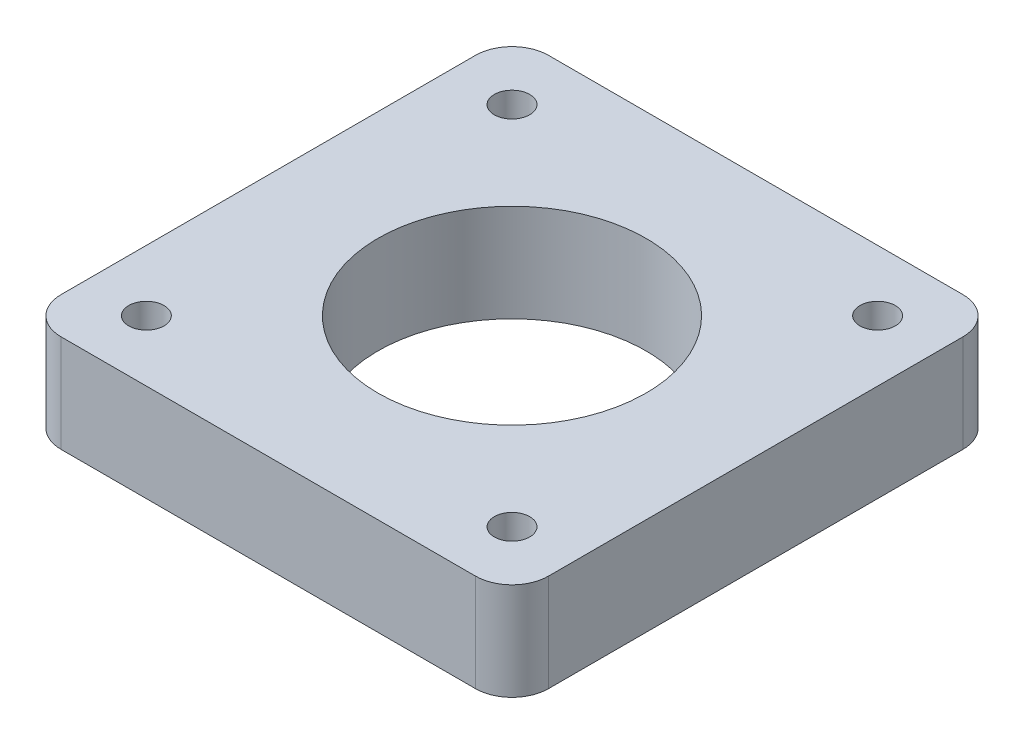
ISO-10303-21;
HEADER;
FILE_DESCRIPTION(('STEP AP214'),'2;1');
FILE_NAME('part.step','',(''),(''),'','','');
FILE_SCHEMA(('AUTOMOTIVE_DESIGN { 1 0 10303 214 1 1 1 1 }'));
ENDSEC;
DATA;
#1=APPLICATION_CONTEXT('core data for automotive mechanical design processes');
#2=APPLICATION_PROTOCOL_DEFINITION('international standard','automotive_design',2000,#1);
#3=PRODUCT_CONTEXT('',#1,'mechanical');
#4=PRODUCT('Part','Part','',(#3));
#5=PRODUCT_RELATED_PRODUCT_CATEGORY('part','',(#4));
#6=PRODUCT_DEFINITION_FORMATION('','',#4);
#7=PRODUCT_DEFINITION_CONTEXT('part definition',#1,'design');
#8=PRODUCT_DEFINITION('design','',#6,#7);
#9=PRODUCT_DEFINITION_SHAPE('','',#8);
#10=(LENGTH_UNIT() NAMED_UNIT(*) SI_UNIT(.MILLI.,.METRE.));
#11=(NAMED_UNIT(*) PLANE_ANGLE_UNIT() SI_UNIT($,.RADIAN.));
#12=(NAMED_UNIT(*) SI_UNIT($,.STERADIAN.) SOLID_ANGLE_UNIT());
#13=UNCERTAINTY_MEASURE_WITH_UNIT(LENGTH_MEASURE(1.E-05),#10,'distance_accuracy_value','');
#14=(GEOMETRIC_REPRESENTATION_CONTEXT(3) GLOBAL_UNCERTAINTY_ASSIGNED_CONTEXT((#13)) GLOBAL_UNIT_ASSIGNED_CONTEXT((#10,
#11,#12)) REPRESENTATION_CONTEXT('',''));
#15=CARTESIAN_POINT('',(0.,0.,0.));
#16=DIRECTION('',(0.,0.,1.));
#17=DIRECTION('',(1.,0.,0.));
#18=AXIS2_PLACEMENT_3D('',#15,#16,#17);
#19=CARTESIAN_POINT('',(0.,8.,0.));
#20=DIRECTION('',(0.,1.,0.));
#21=DIRECTION('',(0.,0.,1.));
#22=AXIS2_PLACEMENT_3D('',#19,#20,#21);
#23=PLANE('',#22);
#24=CARTESIAN_POINT('',(5.,8.,34.8885793871866));
#25=DIRECTION('',(0.,1.,0.));
#26=DIRECTION('',(0.,0.,1.));
#27=AXIS2_PLACEMENT_3D('',#24,#25,#26);
#28=CIRCLE('',#27,1.45);
#29=CARTESIAN_POINT('',(5.,8.,36.3385793871866));
#30=VERTEX_POINT('',#29);
#31=EDGE_CURVE('E190',#30,#30,#28,.T.);
#32=ORIENTED_EDGE('',*,*,#31,.F.);
#33=EDGE_LOOP('',(#32));
#34=FACE_BOUND('',#33,.T.);
#35=CARTESIAN_POINT('',(35.,8.,34.8885793871866));
#36=DIRECTION('',(0.,1.,0.));
#37=DIRECTION('',(0.,0.,1.));
#38=AXIS2_PLACEMENT_3D('',#35,#36,#37);
#39=CIRCLE('',#38,1.45);
#40=CARTESIAN_POINT('',(35.,8.,36.3385793871866));
#41=VERTEX_POINT('',#40);
#42=EDGE_CURVE('E196',#41,#41,#39,.T.);
#43=ORIENTED_EDGE('',*,*,#42,.F.);
#44=EDGE_LOOP('',(#43));
#45=FACE_BOUND('',#44,.T.);
#46=CARTESIAN_POINT('',(35.,8.,4.88857938718663));
#47=DIRECTION('',(0.,1.,0.));
#48=DIRECTION('',(0.,0.,1.));
#49=AXIS2_PLACEMENT_3D('',#46,#47,#48);
#50=CIRCLE('',#49,1.45);
#51=CARTESIAN_POINT('',(35.,8.,6.33857938718663));
#52=VERTEX_POINT('',#51);
#53=EDGE_CURVE('E202',#52,#52,#50,.T.);
#54=ORIENTED_EDGE('',*,*,#53,.F.);
#55=EDGE_LOOP('',(#54));
#56=FACE_BOUND('',#55,.T.);
#57=CARTESIAN_POINT('',(5.,8.,4.88857938718664));
#58=DIRECTION('',(0.,1.,0.));
#59=DIRECTION('',(0.,0.,1.));
#60=AXIS2_PLACEMENT_3D('',#57,#58,#59);
#61=CIRCLE('',#60,1.45);
#62=CARTESIAN_POINT('',(5.,8.,6.33857938718664));
#63=VERTEX_POINT('',#62);
#64=EDGE_CURVE('E184',#63,#63,#61,.T.);
#65=ORIENTED_EDGE('',*,*,#64,.F.);
#66=EDGE_LOOP('',(#65));
#67=FACE_BOUND('',#66,.T.);
#68=DIRECTION('',(1.,0.,0.));
#69=VECTOR('',#68,1.);
#70=CARTESIAN_POINT('',(0.,8.,39.8885793871866));
#71=LINE('',#70,#69);
#72=CARTESIAN_POINT('',(3.,8.,39.8885793871866));
#73=VERTEX_POINT('',#72);
#74=CARTESIAN_POINT('',(37.,8.,39.8885793871866));
#75=VERTEX_POINT('',#74);
#76=EDGE_CURVE('E168',#73,#75,#71,.T.);
#77=ORIENTED_EDGE('',*,*,#76,.T.);
#78=CARTESIAN_POINT('',(37.,8.,36.8885793871866));
#79=DIRECTION('',(0.,1.,0.));
#80=DIRECTION('',(0.,0.,1.));
#81=AXIS2_PLACEMENT_3D('',#78,#79,#80);
#82=CIRCLE('',#81,3.);
#83=CARTESIAN_POINT('',(40.,8.,36.8885793871866));
#84=VERTEX_POINT('',#83);
#85=EDGE_CURVE('E149',#75,#84,#82,.T.);
#86=ORIENTED_EDGE('',*,*,#85,.T.);
#87=DIRECTION('',(0.,0.,-1.));
#88=VECTOR('',#87,1.);
#89=CARTESIAN_POINT('',(40.,8.,-0.111420612813364));
#90=LINE('',#89,#88);
#91=CARTESIAN_POINT('',(40.,8.,2.88857938718664));
#92=VERTEX_POINT('',#91);
#93=EDGE_CURVE('E119',#84,#92,#90,.T.);
#94=ORIENTED_EDGE('',*,*,#93,.T.);
#95=CARTESIAN_POINT('',(37.,8.,2.88857938718664));
#96=DIRECTION('',(0.,1.,0.));
#97=DIRECTION('',(0.,0.,1.));
#98=AXIS2_PLACEMENT_3D('',#95,#96,#97);
#99=CIRCLE('',#98,3.);
#100=CARTESIAN_POINT('',(37.,8.,-0.111420612813364));
#101=VERTEX_POINT('',#100);
#102=EDGE_CURVE('E55',#92,#101,#99,.T.);
#103=ORIENTED_EDGE('',*,*,#102,.T.);
#104=DIRECTION('',(-1.,0.,0.));
#105=VECTOR('',#104,1.);
#106=CARTESIAN_POINT('',(0.,8.,-0.111420612813364));
#107=LINE('',#106,#105);
#108=CARTESIAN_POINT('',(3.,8.,-0.111420612813364));
#109=VERTEX_POINT('',#108);
#110=EDGE_CURVE('E135',#101,#109,#107,.T.);
#111=ORIENTED_EDGE('',*,*,#110,.T.);
#112=CARTESIAN_POINT('',(3.,8.,2.88857938718664));
#113=DIRECTION('',(0.,1.,0.));
#114=DIRECTION('',(0.,0.,1.));
#115=AXIS2_PLACEMENT_3D('',#112,#113,#114);
#116=CIRCLE('',#115,3.);
#117=CARTESIAN_POINT('',(0.,8.,2.88857938718664));
#118=VERTEX_POINT('',#117);
#119=EDGE_CURVE('E146',#109,#118,#116,.T.);
#120=ORIENTED_EDGE('',*,*,#119,.T.);
#121=DIRECTION('',(0.,0.,1.));
#122=VECTOR('',#121,1.);
#123=CARTESIAN_POINT('',(0.,8.,-0.111420612813364));
#124=LINE('',#123,#122);
#125=CARTESIAN_POINT('',(0.,8.,36.8885793871866));
#126=VERTEX_POINT('',#125);
#127=EDGE_CURVE('E129',#118,#126,#124,.T.);
#128=ORIENTED_EDGE('',*,*,#127,.T.);
#129=CARTESIAN_POINT('',(3.,8.,36.8885793871866));
#130=DIRECTION('',(0.,1.,0.));
#131=DIRECTION('',(0.,0.,1.));
#132=AXIS2_PLACEMENT_3D('',#129,#130,#131);
#133=CIRCLE('',#132,3.);
#134=EDGE_CURVE('E144',#126,#73,#133,.T.);
#135=ORIENTED_EDGE('',*,*,#134,.T.);
#136=EDGE_LOOP('',(#77,#86,#94,#103,#111,#120,#128,#135));
#137=FACE_BOUND('',#136,.T.);
#138=CARTESIAN_POINT('',(20.,8.,19.8885793871866));
#139=DIRECTION('',(0.,1.,0.));
#140=DIRECTION('',(0.,0.,1.));
#141=AXIS2_PLACEMENT_3D('',#138,#139,#140);
#142=CIRCLE('',#141,11.);
#143=CARTESIAN_POINT('',(20.,8.,30.8885793871866));
#144=VERTEX_POINT('',#143);
#145=EDGE_CURVE('E173',#144,#144,#142,.T.);
#146=ORIENTED_EDGE('',*,*,#145,.F.);
#147=EDGE_LOOP('',(#146));
#148=FACE_BOUND('',#147,.T.);
#149=ADVANCED_FACE('F33',(#34,#45,#56,#67,#137,#148),#23,.T.);
#150=CARTESIAN_POINT('',(0.,0.,0.));
#151=DIRECTION('',(0.,1.,0.));
#152=DIRECTION('',(0.,0.,1.));
#153=AXIS2_PLACEMENT_3D('',#150,#151,#152);
#154=PLANE('',#153);
#155=CARTESIAN_POINT('',(5.,0.,34.8885793871866));
#156=DIRECTION('',(0.,1.,0.));
#157=DIRECTION('',(0.,0.,1.));
#158=AXIS2_PLACEMENT_3D('',#155,#156,#157);
#159=CIRCLE('',#158,1.45);
#160=CARTESIAN_POINT('',(5.,0.,36.3385793871866));
#161=VERTEX_POINT('',#160);
#162=EDGE_CURVE('E193',#161,#161,#159,.T.);
#163=ORIENTED_EDGE('',*,*,#162,.T.);
#164=EDGE_LOOP('',(#163));
#165=FACE_BOUND('',#164,.T.);
#166=CARTESIAN_POINT('',(35.,0.,34.8885793871866));
#167=DIRECTION('',(0.,1.,0.));
#168=DIRECTION('',(0.,0.,1.));
#169=AXIS2_PLACEMENT_3D('',#166,#167,#168);
#170=CIRCLE('',#169,1.45);
#171=CARTESIAN_POINT('',(35.,0.,36.3385793871866));
#172=VERTEX_POINT('',#171);
#173=EDGE_CURVE('E199',#172,#172,#170,.T.);
#174=ORIENTED_EDGE('',*,*,#173,.T.);
#175=EDGE_LOOP('',(#174));
#176=FACE_BOUND('',#175,.T.);
#177=CARTESIAN_POINT('',(35.,0.,4.88857938718663));
#178=DIRECTION('',(0.,1.,0.));
#179=DIRECTION('',(0.,0.,1.));
#180=AXIS2_PLACEMENT_3D('',#177,#178,#179);
#181=CIRCLE('',#180,1.45);
#182=CARTESIAN_POINT('',(35.,0.,6.33857938718663));
#183=VERTEX_POINT('',#182);
#184=EDGE_CURVE('E187',#183,#183,#181,.T.);
#185=ORIENTED_EDGE('',*,*,#184,.T.);
#186=EDGE_LOOP('',(#185));
#187=FACE_BOUND('',#186,.T.);
#188=CARTESIAN_POINT('',(5.,0.,4.88857938718664));
#189=DIRECTION('',(0.,1.,0.));
#190=DIRECTION('',(0.,0.,1.));
#191=AXIS2_PLACEMENT_3D('',#188,#189,#190);
#192=CIRCLE('',#191,1.45);
#193=CARTESIAN_POINT('',(5.,0.,6.33857938718664));
#194=VERTEX_POINT('',#193);
#195=EDGE_CURVE('E182',#194,#194,#192,.T.);
#196=ORIENTED_EDGE('',*,*,#195,.T.);
#197=EDGE_LOOP('',(#196));
#198=FACE_BOUND('',#197,.T.);
#199=DIRECTION('',(0.,0.,-1.));
#200=VECTOR('',#199,1.);
#201=CARTESIAN_POINT('',(40.,0.,-0.111420612813364));
#202=LINE('',#201,#200);
#203=CARTESIAN_POINT('',(40.,0.,36.8885793871866));
#204=VERTEX_POINT('',#203);
#205=CARTESIAN_POINT('',(40.,0.,2.88857938718664));
#206=VERTEX_POINT('',#205);
#207=EDGE_CURVE('E117',#204,#206,#202,.T.);
#208=ORIENTED_EDGE('',*,*,#207,.F.);
#209=CARTESIAN_POINT('',(37.,0.,36.8885793871866));
#210=DIRECTION('',(0.,1.,0.));
#211=DIRECTION('',(0.,0.,1.));
#212=AXIS2_PLACEMENT_3D('',#209,#210,#211);
#213=CIRCLE('',#212,3.);
#214=CARTESIAN_POINT('',(37.,0.,39.8885793871866));
#215=VERTEX_POINT('',#214);
#216=EDGE_CURVE('E100',#204,#215,#213,.F.);
#217=ORIENTED_EDGE('',*,*,#216,.T.);
#218=DIRECTION('',(1.,0.,0.));
#219=VECTOR('',#218,1.);
#220=CARTESIAN_POINT('',(0.,0.,39.8885793871866));
#221=LINE('',#220,#219);
#222=CARTESIAN_POINT('',(3.,0.,39.8885793871866));
#223=VERTEX_POINT('',#222);
#224=EDGE_CURVE('E127',#223,#215,#221,.T.);
#225=ORIENTED_EDGE('',*,*,#224,.F.);
#226=CARTESIAN_POINT('',(3.,0.,36.8885793871866));
#227=DIRECTION('',(0.,1.,0.));
#228=DIRECTION('',(0.,0.,1.));
#229=AXIS2_PLACEMENT_3D('',#226,#227,#228);
#230=CIRCLE('',#229,3.);
#231=CARTESIAN_POINT('',(0.,0.,36.8885793871866));
#232=VERTEX_POINT('',#231);
#233=EDGE_CURVE('E120',#223,#232,#230,.F.);
#234=ORIENTED_EDGE('',*,*,#233,.T.);
#235=DIRECTION('',(0.,0.,1.));
#236=VECTOR('',#235,1.);
#237=CARTESIAN_POINT('',(0.,0.,-0.111420612813364));
#238=LINE('',#237,#236);
#239=CARTESIAN_POINT('',(0.,0.,2.88857938718664));
#240=VERTEX_POINT('',#239);
#241=EDGE_CURVE('E131',#240,#232,#238,.T.);
#242=ORIENTED_EDGE('',*,*,#241,.F.);
#243=CARTESIAN_POINT('',(3.,0.,2.88857938718664));
#244=DIRECTION('',(0.,1.,0.));
#245=DIRECTION('',(0.,0.,1.));
#246=AXIS2_PLACEMENT_3D('',#243,#244,#245);
#247=CIRCLE('',#246,3.);
#248=CARTESIAN_POINT('',(3.,0.,-0.111420612813364));
#249=VERTEX_POINT('',#248);
#250=EDGE_CURVE('E138',#240,#249,#247,.F.);
#251=ORIENTED_EDGE('',*,*,#250,.T.);
#252=DIRECTION('',(-1.,0.,0.));
#253=VECTOR('',#252,1.);
#254=CARTESIAN_POINT('',(0.,0.,-0.111420612813364));
#255=LINE('',#254,#253);
#256=CARTESIAN_POINT('',(37.,0.,-0.111420612813364));
#257=VERTEX_POINT('',#256);
#258=EDGE_CURVE('E126',#257,#249,#255,.T.);
#259=ORIENTED_EDGE('',*,*,#258,.F.);
#260=CARTESIAN_POINT('',(37.,0.,2.88857938718664));
#261=DIRECTION('',(0.,1.,0.));
#262=DIRECTION('',(0.,0.,1.));
#263=AXIS2_PLACEMENT_3D('',#260,#261,#262);
#264=CIRCLE('',#263,3.);
#265=EDGE_CURVE('E111',#257,#206,#264,.F.);
#266=ORIENTED_EDGE('',*,*,#265,.T.);
#267=EDGE_LOOP('',(#208,#217,#225,#234,#242,#251,#259,#266));
#268=FACE_BOUND('',#267,.T.);
#269=CARTESIAN_POINT('',(20.,0.,19.8885793871866));
#270=DIRECTION('',(0.,1.,0.));
#271=DIRECTION('',(0.,0.,1.));
#272=AXIS2_PLACEMENT_3D('',#269,#270,#271);
#273=CIRCLE('',#272,11.);
#274=CARTESIAN_POINT('',(20.,0.,30.8885793871866));
#275=VERTEX_POINT('',#274);
#276=EDGE_CURVE('E175',#275,#275,#273,.T.);
#277=ORIENTED_EDGE('',*,*,#276,.T.);
#278=EDGE_LOOP('',(#277));
#279=FACE_BOUND('',#278,.T.);
#280=ADVANCED_FACE('F123',(#165,#176,#187,#198,#268,#279),#154,.F.);
#281=CARTESIAN_POINT('',(0.,8.,-0.111420612813364));
#282=DIRECTION('',(1.,0.,0.));
#283=DIRECTION('',(0.,0.,-1.));
#284=AXIS2_PLACEMENT_3D('',#281,#282,#283);
#285=PLANE('',#284);
#286=ORIENTED_EDGE('',*,*,#127,.F.);
#287=DIRECTION('',(0.,-1.,0.));
#288=VECTOR('',#287,1.);
#289=CARTESIAN_POINT('',(0.,8.,2.88857938718664));
#290=LINE('',#289,#288);
#291=EDGE_CURVE('E11',#118,#240,#290,.T.);
#292=ORIENTED_EDGE('',*,*,#291,.T.);
#293=ORIENTED_EDGE('',*,*,#241,.T.);
#294=DIRECTION('',(0.,-1.,0.));
#295=VECTOR('',#294,1.);
#296=CARTESIAN_POINT('',(0.,8.,36.8885793871866));
#297=LINE('',#296,#295);
#298=EDGE_CURVE('E41',#232,#126,#297,.F.);
#299=ORIENTED_EDGE('',*,*,#298,.T.);
#300=EDGE_LOOP('',(#286,#292,#293,#299));
#301=FACE_BOUND('',#300,.T.);
#302=ADVANCED_FACE('F159',(#301),#285,.F.);
#303=CARTESIAN_POINT('',(0.,8.,39.8885793871866));
#304=DIRECTION('',(0.,0.,-1.));
#305=DIRECTION('',(-1.,0.,0.));
#306=AXIS2_PLACEMENT_3D('',#303,#304,#305);
#307=PLANE('',#306);
#308=ORIENTED_EDGE('',*,*,#224,.T.);
#309=DIRECTION('',(0.,-1.,0.));
#310=VECTOR('',#309,1.);
#311=CARTESIAN_POINT('',(37.,8.,39.8885793871866));
#312=LINE('',#311,#310);
#313=EDGE_CURVE('E105',#215,#75,#312,.F.);
#314=ORIENTED_EDGE('',*,*,#313,.T.);
#315=ORIENTED_EDGE('',*,*,#76,.F.);
#316=DIRECTION('',(0.,-1.,0.));
#317=VECTOR('',#316,1.);
#318=CARTESIAN_POINT('',(3.,8.,39.8885793871866));
#319=LINE('',#318,#317);
#320=EDGE_CURVE('E110',#73,#223,#319,.T.);
#321=ORIENTED_EDGE('',*,*,#320,.T.);
#322=EDGE_LOOP('',(#308,#314,#315,#321));
#323=FACE_BOUND('',#322,.T.);
#324=ADVANCED_FACE('F172',(#323),#307,.F.);
#325=CARTESIAN_POINT('',(40.,8.,-0.111420612813364));
#326=DIRECTION('',(-1.,0.,0.));
#327=DIRECTION('',(0.,0.,1.));
#328=AXIS2_PLACEMENT_3D('',#325,#326,#327);
#329=PLANE('',#328);
#330=ORIENTED_EDGE('',*,*,#93,.F.);
#331=DIRECTION('',(0.,-1.,0.));
#332=VECTOR('',#331,1.);
#333=CARTESIAN_POINT('',(40.,8.,36.8885793871866));
#334=LINE('',#333,#332);
#335=EDGE_CURVE('E104',#84,#204,#334,.T.);
#336=ORIENTED_EDGE('',*,*,#335,.T.);
#337=ORIENTED_EDGE('',*,*,#207,.T.);
#338=DIRECTION('',(0.,-1.,0.));
#339=VECTOR('',#338,1.);
#340=CARTESIAN_POINT('',(40.,8.,2.88857938718664));
#341=LINE('',#340,#339);
#342=EDGE_CURVE('E121',#206,#92,#341,.F.);
#343=ORIENTED_EDGE('',*,*,#342,.T.);
#344=EDGE_LOOP('',(#330,#336,#337,#343));
#345=FACE_BOUND('',#344,.T.);
#346=ADVANCED_FACE('F116',(#345),#329,.F.);
#347=CARTESIAN_POINT('',(0.,8.,-0.111420612813364));
#348=DIRECTION('',(0.,0.,1.));
#349=DIRECTION('',(1.,0.,0.));
#350=AXIS2_PLACEMENT_3D('',#347,#348,#349);
#351=PLANE('',#350);
#352=ORIENTED_EDGE('',*,*,#110,.F.);
#353=DIRECTION('',(0.,-1.,0.));
#354=VECTOR('',#353,1.);
#355=CARTESIAN_POINT('',(37.,8.,-0.111420612813364));
#356=LINE('',#355,#354);
#357=EDGE_CURVE('E152',#101,#257,#356,.T.);
#358=ORIENTED_EDGE('',*,*,#357,.T.);
#359=ORIENTED_EDGE('',*,*,#258,.T.);
#360=DIRECTION('',(0.,-1.,0.));
#361=VECTOR('',#360,1.);
#362=CARTESIAN_POINT('',(3.,8.,-0.111420612813364));
#363=LINE('',#362,#361);
#364=EDGE_CURVE('E48',#249,#109,#363,.F.);
#365=ORIENTED_EDGE('',*,*,#364,.T.);
#366=EDGE_LOOP('',(#352,#358,#359,#365));
#367=FACE_BOUND('',#366,.T.);
#368=ADVANCED_FACE('F231',(#367),#351,.F.);
#369=CARTESIAN_POINT('',(20.,8.,19.8885793871866));
#370=DIRECTION('',(0.,-1.,0.));
#371=DIRECTION('',(0.,0.,-1.));
#372=AXIS2_PLACEMENT_3D('',#369,#370,#371);
#373=CYLINDRICAL_SURFACE('',#372,11.);
#374=ORIENTED_EDGE('',*,*,#145,.T.);
#375=EDGE_LOOP('',(#374));
#376=FACE_BOUND('',#375,.T.);
#377=ORIENTED_EDGE('',*,*,#276,.F.);
#378=EDGE_LOOP('',(#377));
#379=FACE_BOUND('',#378,.T.);
#380=ADVANCED_FACE('F225',(#376,#379),#373,.F.);
#381=CARTESIAN_POINT('',(5.,0.,4.88857938718664));
#382=DIRECTION('',(0.,1.,0.));
#383=DIRECTION('',(0.,0.,1.));
#384=AXIS2_PLACEMENT_3D('',#381,#382,#383);
#385=CYLINDRICAL_SURFACE('',#384,1.45);
#386=ORIENTED_EDGE('',*,*,#195,.F.);
#387=EDGE_LOOP('',(#386));
#388=FACE_BOUND('',#387,.T.);
#389=ORIENTED_EDGE('',*,*,#64,.T.);
#390=EDGE_LOOP('',(#389));
#391=FACE_BOUND('',#390,.T.);
#392=ADVANCED_FACE('F214',(#388,#391),#385,.F.);
#393=CARTESIAN_POINT('',(35.,0.,4.88857938718663));
#394=DIRECTION('',(0.,1.,0.));
#395=DIRECTION('',(0.,0.,1.));
#396=AXIS2_PLACEMENT_3D('',#393,#394,#395);
#397=CYLINDRICAL_SURFACE('',#396,1.45);
#398=ORIENTED_EDGE('',*,*,#184,.F.);
#399=EDGE_LOOP('',(#398));
#400=FACE_BOUND('',#399,.T.);
#401=ORIENTED_EDGE('',*,*,#53,.T.);
#402=EDGE_LOOP('',(#401));
#403=FACE_BOUND('',#402,.T.);
#404=ADVANCED_FACE('F210',(#400,#403),#397,.F.);
#405=CARTESIAN_POINT('',(35.,0.,34.8885793871866));
#406=DIRECTION('',(0.,1.,0.));
#407=DIRECTION('',(0.,0.,1.));
#408=AXIS2_PLACEMENT_3D('',#405,#406,#407);
#409=CYLINDRICAL_SURFACE('',#408,1.45);
#410=ORIENTED_EDGE('',*,*,#173,.F.);
#411=EDGE_LOOP('',(#410));
#412=FACE_BOUND('',#411,.T.);
#413=ORIENTED_EDGE('',*,*,#42,.T.);
#414=EDGE_LOOP('',(#413));
#415=FACE_BOUND('',#414,.T.);
#416=ADVANCED_FACE('F213',(#412,#415),#409,.F.);
#417=CARTESIAN_POINT('',(5.,0.,34.8885793871866));
#418=DIRECTION('',(0.,1.,0.));
#419=DIRECTION('',(0.,0.,1.));
#420=AXIS2_PLACEMENT_3D('',#417,#418,#419);
#421=CYLINDRICAL_SURFACE('',#420,1.45);
#422=ORIENTED_EDGE('',*,*,#162,.F.);
#423=EDGE_LOOP('',(#422));
#424=FACE_BOUND('',#423,.T.);
#425=ORIENTED_EDGE('',*,*,#31,.T.);
#426=EDGE_LOOP('',(#425));
#427=FACE_BOUND('',#426,.T.);
#428=ADVANCED_FACE('F236',(#424,#427),#421,.F.);
#429=CARTESIAN_POINT('',(37.,8.,36.8885793871866));
#430=DIRECTION('',(0.,-1.,0.));
#431=DIRECTION('',(0.,0.,-1.));
#432=AXIS2_PLACEMENT_3D('',#429,#430,#431);
#433=CYLINDRICAL_SURFACE('',#432,3.);
#434=ORIENTED_EDGE('',*,*,#85,.F.);
#435=ORIENTED_EDGE('',*,*,#313,.F.);
#436=ORIENTED_EDGE('',*,*,#216,.F.);
#437=ORIENTED_EDGE('',*,*,#335,.F.);
#438=EDGE_LOOP('',(#434,#435,#436,#437));
#439=FACE_BOUND('',#438,.T.);
#440=ADVANCED_FACE('F103',(#439),#433,.T.);
#441=CARTESIAN_POINT('',(37.,8.,2.88857938718664));
#442=DIRECTION('',(0.,-1.,0.));
#443=DIRECTION('',(0.,0.,-1.));
#444=AXIS2_PLACEMENT_3D('',#441,#442,#443);
#445=CYLINDRICAL_SURFACE('',#444,3.);
#446=ORIENTED_EDGE('',*,*,#102,.F.);
#447=ORIENTED_EDGE('',*,*,#342,.F.);
#448=ORIENTED_EDGE('',*,*,#265,.F.);
#449=ORIENTED_EDGE('',*,*,#357,.F.);
#450=EDGE_LOOP('',(#446,#447,#448,#449));
#451=FACE_BOUND('',#450,.T.);
#452=ADVANCED_FACE('F252',(#451),#445,.T.);
#453=CARTESIAN_POINT('',(3.,8.,2.88857938718664));
#454=DIRECTION('',(0.,-1.,0.));
#455=DIRECTION('',(0.,0.,-1.));
#456=AXIS2_PLACEMENT_3D('',#453,#454,#455);
#457=CYLINDRICAL_SURFACE('',#456,3.);
#458=ORIENTED_EDGE('',*,*,#119,.F.);
#459=ORIENTED_EDGE('',*,*,#364,.F.);
#460=ORIENTED_EDGE('',*,*,#250,.F.);
#461=ORIENTED_EDGE('',*,*,#291,.F.);
#462=EDGE_LOOP('',(#458,#459,#460,#461));
#463=FACE_BOUND('',#462,.T.);
#464=ADVANCED_FACE('F254',(#463),#457,.T.);
#465=CARTESIAN_POINT('',(3.,8.,36.8885793871866));
#466=DIRECTION('',(0.,-1.,0.));
#467=DIRECTION('',(0.,0.,-1.));
#468=AXIS2_PLACEMENT_3D('',#465,#466,#467);
#469=CYLINDRICAL_SURFACE('',#468,3.);
#470=ORIENTED_EDGE('',*,*,#134,.F.);
#471=ORIENTED_EDGE('',*,*,#298,.F.);
#472=ORIENTED_EDGE('',*,*,#233,.F.);
#473=ORIENTED_EDGE('',*,*,#320,.F.);
#474=EDGE_LOOP('',(#470,#471,#472,#473));
#475=FACE_BOUND('',#474,.T.);
#476=ADVANCED_FACE('F35',(#475),#469,.T.);
#477=CLOSED_SHELL('',(#149,#280,#302,#324,#346,#368,#380,#392,#404,#416,#428,#440,#452,#464,#476));
#478=MANIFOLD_SOLID_BREP('B2',#477);
#479=ADVANCED_BREP_SHAPE_REPRESENTATION('',(#18,#478),#14);
#480=SHAPE_DEFINITION_REPRESENTATION(#9,#479);
ENDSEC;
END-ISO-10303-21;
